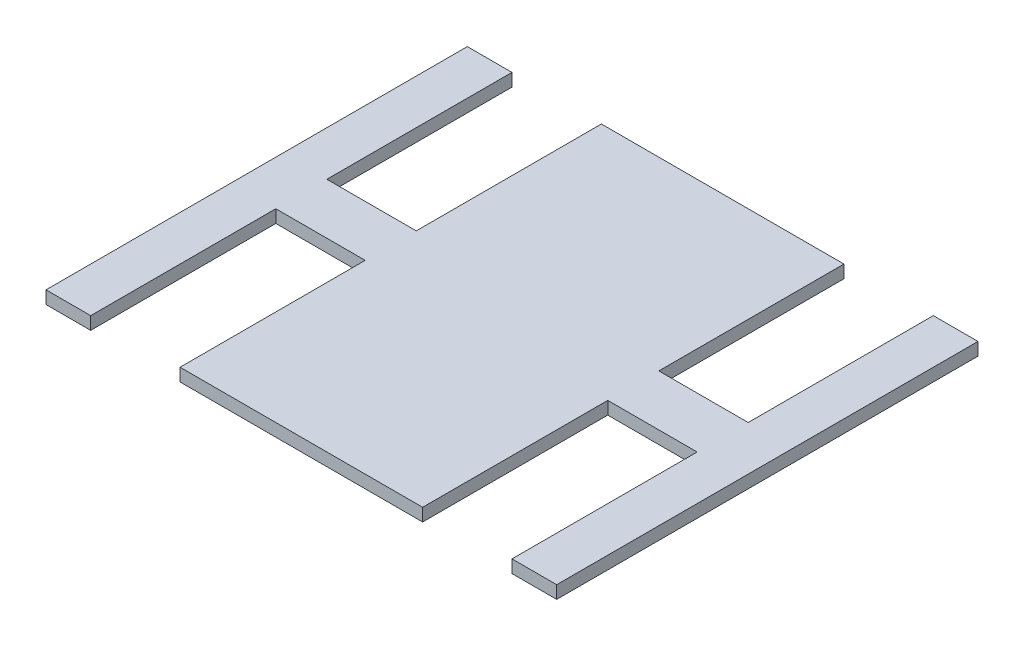
ISO-10303-21;
HEADER;
FILE_DESCRIPTION(('STEP AP214'),'2;1');
FILE_NAME('part.step','',(''),(''),'','','');
FILE_SCHEMA(('AUTOMOTIVE_DESIGN { 1 0 10303 214 1 1 1 1 }'));
ENDSEC;
DATA;
#1=APPLICATION_CONTEXT('core data for automotive mechanical design processes');
#2=APPLICATION_PROTOCOL_DEFINITION('international standard','automotive_design',2000,#1);
#3=PRODUCT_CONTEXT('',#1,'mechanical');
#4=PRODUCT('Part','Part','',(#3));
#5=PRODUCT_RELATED_PRODUCT_CATEGORY('part','',(#4));
#6=PRODUCT_DEFINITION_FORMATION('','',#4);
#7=PRODUCT_DEFINITION_CONTEXT('part definition',#1,'design');
#8=PRODUCT_DEFINITION('design','',#6,#7);
#9=PRODUCT_DEFINITION_SHAPE('','',#8);
#10=(LENGTH_UNIT() NAMED_UNIT(*) SI_UNIT(.MILLI.,.METRE.));
#11=(NAMED_UNIT(*) PLANE_ANGLE_UNIT() SI_UNIT($,.RADIAN.));
#12=(NAMED_UNIT(*) SI_UNIT($,.STERADIAN.) SOLID_ANGLE_UNIT());
#13=UNCERTAINTY_MEASURE_WITH_UNIT(LENGTH_MEASURE(1.E-05),#10,'distance_accuracy_value','');
#14=(GEOMETRIC_REPRESENTATION_CONTEXT(3) GLOBAL_UNCERTAINTY_ASSIGNED_CONTEXT((#13)) GLOBAL_UNIT_ASSIGNED_CONTEXT((#10,
#11,#12)) REPRESENTATION_CONTEXT('',''));
#15=CARTESIAN_POINT('',(0.,0.,0.));
#16=DIRECTION('',(0.,0.,1.));
#17=DIRECTION('',(1.,0.,0.));
#18=AXIS2_PLACEMENT_3D('',#15,#16,#17);
#19=CARTESIAN_POINT('',(0.,10.,165.));
#20=DIRECTION('',(0.,0.,-1.));
#21=DIRECTION('',(-1.,0.,0.));
#22=AXIS2_PLACEMENT_3D('',#19,#20,#21);
#23=PLANE('',#22);
#24=DIRECTION('',(1.,0.,0.));
#25=VECTOR('',#24,1.);
#26=CARTESIAN_POINT('',(0.,0.,165.));
#27=LINE('',#26,#25);
#28=CARTESIAN_POINT('',(-95.,0.,165.));
#29=VERTEX_POINT('',#28);
#30=CARTESIAN_POINT('',(95.,0.,165.));
#31=VERTEX_POINT('',#30);
#32=EDGE_CURVE('E206',#29,#31,#27,.T.);
#33=ORIENTED_EDGE('',*,*,#32,.T.);
#34=DIRECTION('',(0.,-1.,0.));
#35=VECTOR('',#34,1.);
#36=CARTESIAN_POINT('',(95.,10.,165.));
#37=LINE('',#36,#35);
#38=CARTESIAN_POINT('',(95.,10.,165.));
#39=VERTEX_POINT('',#38);
#40=EDGE_CURVE('E11',#39,#31,#37,.T.);
#41=ORIENTED_EDGE('',*,*,#40,.F.);
#42=DIRECTION('',(1.,0.,0.));
#43=VECTOR('',#42,1.);
#44=CARTESIAN_POINT('',(0.,10.,165.));
#45=LINE('',#44,#43);
#46=CARTESIAN_POINT('',(-95.,10.,165.));
#47=VERTEX_POINT('',#46);
#48=EDGE_CURVE('E254',#47,#39,#45,.T.);
#49=ORIENTED_EDGE('',*,*,#48,.F.);
#50=DIRECTION('',(0.,-1.,0.));
#51=VECTOR('',#50,1.);
#52=CARTESIAN_POINT('',(-95.,10.,165.));
#53=LINE('',#52,#51);
#54=EDGE_CURVE('E52',#47,#29,#53,.T.);
#55=ORIENTED_EDGE('',*,*,#54,.T.);
#56=EDGE_LOOP('',(#33,#41,#49,#55));
#57=FACE_BOUND('',#56,.T.);
#58=ADVANCED_FACE('F35',(#57),#23,.F.);
#59=CARTESIAN_POINT('',(95.,10.,0.));
#60=DIRECTION('',(-1.,0.,0.));
#61=DIRECTION('',(0.,0.,1.));
#62=AXIS2_PLACEMENT_3D('',#59,#60,#61);
#63=PLANE('',#62);
#64=DIRECTION('',(0.,0.,-1.));
#65=VECTOR('',#64,1.);
#66=CARTESIAN_POINT('',(95.,0.,0.));
#67=LINE('',#66,#65);
#68=CARTESIAN_POINT('',(95.,0.,20.));
#69=VERTEX_POINT('',#68);
#70=EDGE_CURVE('E208',#31,#69,#67,.T.);
#71=ORIENTED_EDGE('',*,*,#70,.T.);
#72=DIRECTION('',(0.,-1.,0.));
#73=VECTOR('',#72,1.);
#74=CARTESIAN_POINT('',(95.,10.,20.));
#75=LINE('',#74,#73);
#76=CARTESIAN_POINT('',(95.,10.,20.));
#77=VERTEX_POINT('',#76);
#78=EDGE_CURVE('E44',#77,#69,#75,.T.);
#79=ORIENTED_EDGE('',*,*,#78,.F.);
#80=DIRECTION('',(0.,0.,-1.));
#81=VECTOR('',#80,1.);
#82=CARTESIAN_POINT('',(95.,10.,0.));
#83=LINE('',#82,#81);
#84=EDGE_CURVE('E126',#39,#77,#83,.T.);
#85=ORIENTED_EDGE('',*,*,#84,.F.);
#86=ORIENTED_EDGE('',*,*,#40,.T.);
#87=EDGE_LOOP('',(#71,#79,#85,#86));
#88=FACE_BOUND('',#87,.T.);
#89=ADVANCED_FACE('F37',(#88),#63,.F.);
#90=CARTESIAN_POINT('',(0.,10.,20.0000000000001));
#91=DIRECTION('',(0.,0.,1.));
#92=DIRECTION('',(1.,0.,0.));
#93=AXIS2_PLACEMENT_3D('',#90,#91,#92);
#94=PLANE('',#93);
#95=DIRECTION('',(-1.,0.,0.));
#96=VECTOR('',#95,1.);
#97=CARTESIAN_POINT('',(0.,0.,20.0000000000001));
#98=LINE('',#97,#96);
#99=CARTESIAN_POINT('',(165.,0.,20.));
#100=VERTEX_POINT('',#99);
#101=EDGE_CURVE('E213',#100,#69,#98,.T.);
#102=ORIENTED_EDGE('',*,*,#101,.F.);
#103=DIRECTION('',(0.,-1.,0.));
#104=VECTOR('',#103,1.);
#105=CARTESIAN_POINT('',(165.,10.,20.));
#106=LINE('',#105,#104);
#107=CARTESIAN_POINT('',(165.,10.,20.));
#108=VERTEX_POINT('',#107);
#109=EDGE_CURVE('E285',#108,#100,#106,.T.);
#110=ORIENTED_EDGE('',*,*,#109,.F.);
#111=DIRECTION('',(-1.,0.,0.));
#112=VECTOR('',#111,1.);
#113=CARTESIAN_POINT('',(0.,10.,20.0000000000001));
#114=LINE('',#113,#112);
#115=EDGE_CURVE('E291',#108,#77,#114,.T.);
#116=ORIENTED_EDGE('',*,*,#115,.T.);
#117=ORIENTED_EDGE('',*,*,#78,.T.);
#118=EDGE_LOOP('',(#102,#110,#116,#117));
#119=FACE_BOUND('',#118,.T.);
#120=ADVANCED_FACE('F289',(#119),#94,.T.);
#121=CARTESIAN_POINT('',(165.,10.,0.));
#122=DIRECTION('',(-1.,0.,0.));
#123=DIRECTION('',(0.,0.,1.));
#124=AXIS2_PLACEMENT_3D('',#121,#122,#123);
#125=PLANE('',#124);
#126=DIRECTION('',(0.,0.,-1.));
#127=VECTOR('',#126,1.);
#128=CARTESIAN_POINT('',(165.,0.,0.));
#129=LINE('',#128,#127);
#130=CARTESIAN_POINT('',(165.,0.,165.));
#131=VERTEX_POINT('',#130);
#132=EDGE_CURVE('E216',#131,#100,#129,.T.);
#133=ORIENTED_EDGE('',*,*,#132,.F.);
#134=DIRECTION('',(0.,-1.,0.));
#135=VECTOR('',#134,1.);
#136=CARTESIAN_POINT('',(165.,10.,165.));
#137=LINE('',#136,#135);
#138=CARTESIAN_POINT('',(165.,10.,165.));
#139=VERTEX_POINT('',#138);
#140=EDGE_CURVE('E283',#139,#131,#137,.T.);
#141=ORIENTED_EDGE('',*,*,#140,.F.);
#142=DIRECTION('',(0.,0.,-1.));
#143=VECTOR('',#142,1.);
#144=CARTESIAN_POINT('',(165.,10.,0.));
#145=LINE('',#144,#143);
#146=EDGE_CURVE('E303',#139,#108,#145,.T.);
#147=ORIENTED_EDGE('',*,*,#146,.T.);
#148=ORIENTED_EDGE('',*,*,#109,.T.);
#149=EDGE_LOOP('',(#133,#141,#147,#148));
#150=FACE_BOUND('',#149,.T.);
#151=ADVANCED_FACE('F299',(#150),#125,.T.);
#152=CARTESIAN_POINT('',(200.,0.,165.));
#153=VERTEX_POINT('',#152);
#154=EDGE_CURVE('E210',#131,#153,#27,.T.);
#155=ORIENTED_EDGE('',*,*,#154,.T.);
#156=DIRECTION('',(0.,-1.,0.));
#157=VECTOR('',#156,1.);
#158=CARTESIAN_POINT('',(200.,10.,165.));
#159=LINE('',#158,#157);
#160=CARTESIAN_POINT('',(200.,10.,165.));
#161=VERTEX_POINT('',#160);
#162=EDGE_CURVE('E280',#161,#153,#159,.T.);
#163=ORIENTED_EDGE('',*,*,#162,.F.);
#164=EDGE_CURVE('E305',#139,#161,#45,.T.);
#165=ORIENTED_EDGE('',*,*,#164,.F.);
#166=ORIENTED_EDGE('',*,*,#140,.T.);
#167=EDGE_LOOP('',(#155,#163,#165,#166));
#168=FACE_BOUND('',#167,.T.);
#169=ADVANCED_FACE('F380',(#168),#23,.F.);
#170=CARTESIAN_POINT('',(200.,10.,0.));
#171=DIRECTION('',(-1.,0.,0.));
#172=DIRECTION('',(0.,0.,1.));
#173=AXIS2_PLACEMENT_3D('',#170,#171,#172);
#174=PLANE('',#173);
#175=DIRECTION('',(0.,0.,-1.));
#176=VECTOR('',#175,1.);
#177=CARTESIAN_POINT('',(200.,0.,0.));
#178=LINE('',#177,#176);
#179=CARTESIAN_POINT('',(200.,0.,-165.));
#180=VERTEX_POINT('',#179);
#181=EDGE_CURVE('E219',#153,#180,#178,.T.);
#182=ORIENTED_EDGE('',*,*,#181,.T.);
#183=DIRECTION('',(0.,-1.,0.));
#184=VECTOR('',#183,1.);
#185=CARTESIAN_POINT('',(200.,10.,-165.));
#186=LINE('',#185,#184);
#187=CARTESIAN_POINT('',(200.,10.,-165.));
#188=VERTEX_POINT('',#187);
#189=EDGE_CURVE('E278',#188,#180,#186,.T.);
#190=ORIENTED_EDGE('',*,*,#189,.F.);
#191=DIRECTION('',(0.,0.,-1.));
#192=VECTOR('',#191,1.);
#193=CARTESIAN_POINT('',(200.,10.,0.));
#194=LINE('',#193,#192);
#195=EDGE_CURVE('E310',#161,#188,#194,.T.);
#196=ORIENTED_EDGE('',*,*,#195,.F.);
#197=ORIENTED_EDGE('',*,*,#162,.T.);
#198=EDGE_LOOP('',(#182,#190,#196,#197));
#199=FACE_BOUND('',#198,.T.);
#200=ADVANCED_FACE('F388',(#199),#174,.F.);
#201=CARTESIAN_POINT('',(0.,10.,-165.));
#202=DIRECTION('',(0.,0.,-1.));
#203=DIRECTION('',(-1.,0.,0.));
#204=AXIS2_PLACEMENT_3D('',#201,#202,#203);
#205=PLANE('',#204);
#206=DIRECTION('',(1.,0.,0.));
#207=VECTOR('',#206,1.);
#208=CARTESIAN_POINT('',(0.,0.,-165.));
#209=LINE('',#208,#207);
#210=CARTESIAN_POINT('',(165.,0.,-165.));
#211=VERTEX_POINT('',#210);
#212=EDGE_CURVE('E222',#211,#180,#209,.T.);
#213=ORIENTED_EDGE('',*,*,#212,.F.);
#214=DIRECTION('',(0.,-1.,0.));
#215=VECTOR('',#214,1.);
#216=CARTESIAN_POINT('',(165.,10.,-165.));
#217=LINE('',#216,#215);
#218=CARTESIAN_POINT('',(165.,10.,-165.));
#219=VERTEX_POINT('',#218);
#220=EDGE_CURVE('E276',#219,#211,#217,.T.);
#221=ORIENTED_EDGE('',*,*,#220,.F.);
#222=DIRECTION('',(1.,0.,0.));
#223=VECTOR('',#222,1.);
#224=CARTESIAN_POINT('',(0.,10.,-165.));
#225=LINE('',#224,#223);
#226=EDGE_CURVE('E312',#219,#188,#225,.T.);
#227=ORIENTED_EDGE('',*,*,#226,.T.);
#228=ORIENTED_EDGE('',*,*,#189,.T.);
#229=EDGE_LOOP('',(#213,#221,#227,#228));
#230=FACE_BOUND('',#229,.T.);
#231=ADVANCED_FACE('F376',(#230),#205,.T.);
#232=CARTESIAN_POINT('',(165.,10.,0.));
#233=DIRECTION('',(1.,0.,0.));
#234=DIRECTION('',(0.,0.,-1.));
#235=AXIS2_PLACEMENT_3D('',#232,#233,#234);
#236=PLANE('',#235);
#237=DIRECTION('',(0.,0.,1.));
#238=VECTOR('',#237,1.);
#239=CARTESIAN_POINT('',(165.,0.,0.));
#240=LINE('',#239,#238);
#241=CARTESIAN_POINT('',(165.,0.,-20.));
#242=VERTEX_POINT('',#241);
#243=EDGE_CURVE('E225',#211,#242,#240,.T.);
#244=ORIENTED_EDGE('',*,*,#243,.T.);
#245=DIRECTION('',(0.,-1.,0.));
#246=VECTOR('',#245,1.);
#247=CARTESIAN_POINT('',(165.,10.,-20.));
#248=LINE('',#247,#246);
#249=CARTESIAN_POINT('',(165.,10.,-20.));
#250=VERTEX_POINT('',#249);
#251=EDGE_CURVE('E274',#250,#242,#248,.T.);
#252=ORIENTED_EDGE('',*,*,#251,.F.);
#253=DIRECTION('',(0.,0.,1.));
#254=VECTOR('',#253,1.);
#255=CARTESIAN_POINT('',(165.,10.,0.));
#256=LINE('',#255,#254);
#257=EDGE_CURVE('E315',#219,#250,#256,.T.);
#258=ORIENTED_EDGE('',*,*,#257,.F.);
#259=ORIENTED_EDGE('',*,*,#220,.T.);
#260=EDGE_LOOP('',(#244,#252,#258,#259));
#261=FACE_BOUND('',#260,.T.);
#262=ADVANCED_FACE('F488',(#261),#236,.F.);
#263=CARTESIAN_POINT('',(0.,10.,-20.));
#264=DIRECTION('',(0.,0.,-1.));
#265=DIRECTION('',(-1.,0.,0.));
#266=AXIS2_PLACEMENT_3D('',#263,#264,#265);
#267=PLANE('',#266);
#268=DIRECTION('',(1.,0.,0.));
#269=VECTOR('',#268,1.);
#270=CARTESIAN_POINT('',(0.,0.,-20.));
#271=LINE('',#270,#269);
#272=CARTESIAN_POINT('',(95.,0.,-20.));
#273=VERTEX_POINT('',#272);
#274=EDGE_CURVE('E230',#273,#242,#271,.T.);
#275=ORIENTED_EDGE('',*,*,#274,.F.);
#276=DIRECTION('',(0.,-1.,0.));
#277=VECTOR('',#276,1.);
#278=CARTESIAN_POINT('',(95.,10.,-20.));
#279=LINE('',#278,#277);
#280=CARTESIAN_POINT('',(95.,10.,-20.));
#281=VERTEX_POINT('',#280);
#282=EDGE_CURVE('E272',#281,#273,#279,.T.);
#283=ORIENTED_EDGE('',*,*,#282,.F.);
#284=DIRECTION('',(1.,0.,0.));
#285=VECTOR('',#284,1.);
#286=CARTESIAN_POINT('',(0.,10.,-20.));
#287=LINE('',#286,#285);
#288=EDGE_CURVE('E319',#281,#250,#287,.T.);
#289=ORIENTED_EDGE('',*,*,#288,.T.);
#290=ORIENTED_EDGE('',*,*,#251,.T.);
#291=EDGE_LOOP('',(#275,#283,#289,#290));
#292=FACE_BOUND('',#291,.T.);
#293=ADVANCED_FACE('F480',(#292),#267,.T.);
#294=CARTESIAN_POINT('',(95.,10.,0.));
#295=DIRECTION('',(1.,0.,0.));
#296=DIRECTION('',(0.,0.,-1.));
#297=AXIS2_PLACEMENT_3D('',#294,#295,#296);
#298=PLANE('',#297);
#299=DIRECTION('',(0.,0.,1.));
#300=VECTOR('',#299,1.);
#301=CARTESIAN_POINT('',(95.,0.,0.));
#302=LINE('',#301,#300);
#303=CARTESIAN_POINT('',(95.,0.,-165.));
#304=VERTEX_POINT('',#303);
#305=EDGE_CURVE('E233',#304,#273,#302,.T.);
#306=ORIENTED_EDGE('',*,*,#305,.F.);
#307=DIRECTION('',(0.,-1.,0.));
#308=VECTOR('',#307,1.);
#309=CARTESIAN_POINT('',(95.,10.,-165.));
#310=LINE('',#309,#308);
#311=CARTESIAN_POINT('',(95.,10.,-165.));
#312=VERTEX_POINT('',#311);
#313=EDGE_CURVE('E270',#312,#304,#310,.T.);
#314=ORIENTED_EDGE('',*,*,#313,.F.);
#315=DIRECTION('',(0.,0.,1.));
#316=VECTOR('',#315,1.);
#317=CARTESIAN_POINT('',(95.,10.,0.));
#318=LINE('',#317,#316);
#319=EDGE_CURVE('E322',#312,#281,#318,.T.);
#320=ORIENTED_EDGE('',*,*,#319,.T.);
#321=ORIENTED_EDGE('',*,*,#282,.T.);
#322=EDGE_LOOP('',(#306,#314,#320,#321));
#323=FACE_BOUND('',#322,.T.);
#324=ADVANCED_FACE('F350',(#323),#298,.T.);
#325=CARTESIAN_POINT('',(-95.0000000000001,0.,-165.));
#326=VERTEX_POINT('',#325);
#327=EDGE_CURVE('E227',#326,#304,#209,.T.);
#328=ORIENTED_EDGE('',*,*,#327,.F.);
#329=DIRECTION('',(0.,-1.,0.));
#330=VECTOR('',#329,1.);
#331=CARTESIAN_POINT('',(-95.0000000000001,10.,-165.));
#332=LINE('',#331,#330);
#333=CARTESIAN_POINT('',(-95.0000000000001,10.,-165.));
#334=VERTEX_POINT('',#333);
#335=EDGE_CURVE('E268',#334,#326,#332,.T.);
#336=ORIENTED_EDGE('',*,*,#335,.F.);
#337=EDGE_CURVE('E317',#334,#312,#225,.T.);
#338=ORIENTED_EDGE('',*,*,#337,.T.);
#339=ORIENTED_EDGE('',*,*,#313,.T.);
#340=EDGE_LOOP('',(#328,#336,#338,#339));
#341=FACE_BOUND('',#340,.T.);
#342=ADVANCED_FACE('F342',(#341),#205,.T.);
#343=CARTESIAN_POINT('',(-95.,10.,0.));
#344=DIRECTION('',(1.,0.,0.));
#345=DIRECTION('',(0.,0.,-1.));
#346=AXIS2_PLACEMENT_3D('',#343,#344,#345);
#347=PLANE('',#346);
#348=DIRECTION('',(0.,0.,1.));
#349=VECTOR('',#348,1.);
#350=CARTESIAN_POINT('',(-95.,0.,0.));
#351=LINE('',#350,#349);
#352=CARTESIAN_POINT('',(-95.,0.,-20.));
#353=VERTEX_POINT('',#352);
#354=EDGE_CURVE('E236',#326,#353,#351,.T.);
#355=ORIENTED_EDGE('',*,*,#354,.T.);
#356=DIRECTION('',(0.,-1.,0.));
#357=VECTOR('',#356,1.);
#358=CARTESIAN_POINT('',(-95.,10.,-20.));
#359=LINE('',#358,#357);
#360=CARTESIAN_POINT('',(-95.,10.,-20.));
#361=VERTEX_POINT('',#360);
#362=EDGE_CURVE('E266',#361,#353,#359,.T.);
#363=ORIENTED_EDGE('',*,*,#362,.F.);
#364=DIRECTION('',(0.,0.,1.));
#365=VECTOR('',#364,1.);
#366=CARTESIAN_POINT('',(-95.,10.,0.));
#367=LINE('',#366,#365);
#368=EDGE_CURVE('E325',#334,#361,#367,.T.);
#369=ORIENTED_EDGE('',*,*,#368,.F.);
#370=ORIENTED_EDGE('',*,*,#335,.T.);
#371=EDGE_LOOP('',(#355,#363,#369,#370));
#372=FACE_BOUND('',#371,.T.);
#373=ADVANCED_FACE('F367',(#372),#347,.F.);
#374=CARTESIAN_POINT('',(0.,10.,-20.));
#375=DIRECTION('',(0.,0.,-1.));
#376=DIRECTION('',(-1.,0.,0.));
#377=AXIS2_PLACEMENT_3D('',#374,#375,#376);
#378=PLANE('',#377);
#379=DIRECTION('',(1.,0.,0.));
#380=VECTOR('',#379,1.);
#381=CARTESIAN_POINT('',(0.,0.,-20.));
#382=LINE('',#381,#380);
#383=CARTESIAN_POINT('',(-165.,0.,-20.));
#384=VERTEX_POINT('',#383);
#385=EDGE_CURVE('E239',#384,#353,#382,.T.);
#386=ORIENTED_EDGE('',*,*,#385,.F.);
#387=DIRECTION('',(0.,-1.,0.));
#388=VECTOR('',#387,1.);
#389=CARTESIAN_POINT('',(-165.,10.,-20.));
#390=LINE('',#389,#388);
#391=CARTESIAN_POINT('',(-165.,10.,-20.));
#392=VERTEX_POINT('',#391);
#393=EDGE_CURVE('E264',#392,#384,#390,.T.);
#394=ORIENTED_EDGE('',*,*,#393,.F.);
#395=DIRECTION('',(1.,0.,0.));
#396=VECTOR('',#395,1.);
#397=CARTESIAN_POINT('',(0.,10.,-20.));
#398=LINE('',#397,#396);
#399=EDGE_CURVE('E327',#392,#361,#398,.T.);
#400=ORIENTED_EDGE('',*,*,#399,.T.);
#401=ORIENTED_EDGE('',*,*,#362,.T.);
#402=EDGE_LOOP('',(#386,#394,#400,#401));
#403=FACE_BOUND('',#402,.T.);
#404=ADVANCED_FACE('F365',(#403),#378,.T.);
#405=CARTESIAN_POINT('',(-165.,10.,0.));
#406=DIRECTION('',(1.,0.,0.));
#407=DIRECTION('',(0.,0.,-1.));
#408=AXIS2_PLACEMENT_3D('',#405,#406,#407);
#409=PLANE('',#408);
#410=DIRECTION('',(0.,0.,1.));
#411=VECTOR('',#410,1.);
#412=CARTESIAN_POINT('',(-165.,0.,0.));
#413=LINE('',#412,#411);
#414=CARTESIAN_POINT('',(-165.,0.,-165.));
#415=VERTEX_POINT('',#414);
#416=EDGE_CURVE('E242',#415,#384,#413,.T.);
#417=ORIENTED_EDGE('',*,*,#416,.F.);
#418=DIRECTION('',(0.,-1.,0.));
#419=VECTOR('',#418,1.);
#420=CARTESIAN_POINT('',(-165.,10.,-165.));
#421=LINE('',#420,#419);
#422=CARTESIAN_POINT('',(-165.,10.,-165.));
#423=VERTEX_POINT('',#422);
#424=EDGE_CURVE('E262',#423,#415,#421,.T.);
#425=ORIENTED_EDGE('',*,*,#424,.F.);
#426=DIRECTION('',(0.,0.,1.));
#427=VECTOR('',#426,1.);
#428=CARTESIAN_POINT('',(-165.,10.,0.));
#429=LINE('',#428,#427);
#430=EDGE_CURVE('E330',#423,#392,#429,.T.);
#431=ORIENTED_EDGE('',*,*,#430,.T.);
#432=ORIENTED_EDGE('',*,*,#393,.T.);
#433=EDGE_LOOP('',(#417,#425,#431,#432));
#434=FACE_BOUND('',#433,.T.);
#435=ADVANCED_FACE('F362',(#434),#409,.T.);
#436=CARTESIAN_POINT('',(-200.,0.,-165.));
#437=VERTEX_POINT('',#436);
#438=EDGE_CURVE('E226',#437,#415,#209,.T.);
#439=ORIENTED_EDGE('',*,*,#438,.F.);
#440=DIRECTION('',(0.,-1.,0.));
#441=VECTOR('',#440,1.);
#442=CARTESIAN_POINT('',(-200.,10.,-165.));
#443=LINE('',#442,#441);
#444=CARTESIAN_POINT('',(-200.,10.,-165.));
#445=VERTEX_POINT('',#444);
#446=EDGE_CURVE('E260',#445,#437,#443,.T.);
#447=ORIENTED_EDGE('',*,*,#446,.F.);
#448=EDGE_CURVE('E316',#445,#423,#225,.T.);
#449=ORIENTED_EDGE('',*,*,#448,.T.);
#450=ORIENTED_EDGE('',*,*,#424,.T.);
#451=EDGE_LOOP('',(#439,#447,#449,#450));
#452=FACE_BOUND('',#451,.T.);
#453=ADVANCED_FACE('F359',(#452),#205,.T.);
#454=CARTESIAN_POINT('',(-200.,10.,0.));
#455=DIRECTION('',(-1.,0.,0.));
#456=DIRECTION('',(0.,0.,1.));
#457=AXIS2_PLACEMENT_3D('',#454,#455,#456);
#458=PLANE('',#457);
#459=DIRECTION('',(0.,0.,-1.));
#460=VECTOR('',#459,1.);
#461=CARTESIAN_POINT('',(-200.,0.,0.));
#462=LINE('',#461,#460);
#463=CARTESIAN_POINT('',(-200.,0.,165.));
#464=VERTEX_POINT('',#463);
#465=EDGE_CURVE('E245',#464,#437,#462,.T.);
#466=ORIENTED_EDGE('',*,*,#465,.F.);
#467=DIRECTION('',(0.,-1.,0.));
#468=VECTOR('',#467,1.);
#469=CARTESIAN_POINT('',(-200.,10.,165.));
#470=LINE('',#469,#468);
#471=CARTESIAN_POINT('',(-200.,10.,165.));
#472=VERTEX_POINT('',#471);
#473=EDGE_CURVE('E258',#472,#464,#470,.T.);
#474=ORIENTED_EDGE('',*,*,#473,.F.);
#475=DIRECTION('',(0.,0.,-1.));
#476=VECTOR('',#475,1.);
#477=CARTESIAN_POINT('',(-200.,10.,0.));
#478=LINE('',#477,#476);
#479=EDGE_CURVE('E332',#472,#445,#478,.T.);
#480=ORIENTED_EDGE('',*,*,#479,.T.);
#481=ORIENTED_EDGE('',*,*,#446,.T.);
#482=EDGE_LOOP('',(#466,#474,#480,#481));
#483=FACE_BOUND('',#482,.T.);
#484=ADVANCED_FACE('F391',(#483),#458,.T.);
#485=CARTESIAN_POINT('',(-165.,0.,165.));
#486=VERTEX_POINT('',#485);
#487=EDGE_CURVE('E209',#464,#486,#27,.T.);
#488=ORIENTED_EDGE('',*,*,#487,.T.);
#489=DIRECTION('',(0.,-1.,0.));
#490=VECTOR('',#489,1.);
#491=CARTESIAN_POINT('',(-165.,10.,165.));
#492=LINE('',#491,#490);
#493=CARTESIAN_POINT('',(-165.,10.,165.));
#494=VERTEX_POINT('',#493);
#495=EDGE_CURVE('E198',#494,#486,#492,.T.);
#496=ORIENTED_EDGE('',*,*,#495,.F.);
#497=EDGE_CURVE('E186',#472,#494,#45,.T.);
#498=ORIENTED_EDGE('',*,*,#497,.F.);
#499=ORIENTED_EDGE('',*,*,#473,.T.);
#500=EDGE_LOOP('',(#488,#496,#498,#499));
#501=FACE_BOUND('',#500,.T.);
#502=ADVANCED_FACE('F381',(#501),#23,.F.);
#503=CARTESIAN_POINT('',(-165.,10.,0.));
#504=DIRECTION('',(-1.,0.,0.));
#505=DIRECTION('',(0.,0.,1.));
#506=AXIS2_PLACEMENT_3D('',#503,#504,#505);
#507=PLANE('',#506);
#508=DIRECTION('',(0.,0.,-1.));
#509=VECTOR('',#508,1.);
#510=CARTESIAN_POINT('',(-165.,0.,0.));
#511=LINE('',#510,#509);
#512=CARTESIAN_POINT('',(-165.,0.,20.));
#513=VERTEX_POINT('',#512);
#514=EDGE_CURVE('E195',#486,#513,#511,.T.);
#515=ORIENTED_EDGE('',*,*,#514,.T.);
#516=DIRECTION('',(0.,-1.,0.));
#517=VECTOR('',#516,1.);
#518=CARTESIAN_POINT('',(-165.,10.,20.));
#519=LINE('',#518,#517);
#520=CARTESIAN_POINT('',(-165.,10.,20.));
#521=VERTEX_POINT('',#520);
#522=EDGE_CURVE('E192',#521,#513,#519,.T.);
#523=ORIENTED_EDGE('',*,*,#522,.F.);
#524=DIRECTION('',(0.,0.,-1.));
#525=VECTOR('',#524,1.);
#526=CARTESIAN_POINT('',(-165.,10.,0.));
#527=LINE('',#526,#525);
#528=EDGE_CURVE('E178',#494,#521,#527,.T.);
#529=ORIENTED_EDGE('',*,*,#528,.F.);
#530=ORIENTED_EDGE('',*,*,#495,.T.);
#531=EDGE_LOOP('',(#515,#523,#529,#530));
#532=FACE_BOUND('',#531,.T.);
#533=ADVANCED_FACE('F193',(#532),#507,.F.);
#534=CARTESIAN_POINT('',(0.,10.,20.));
#535=DIRECTION('',(0.,0.,1.));
#536=DIRECTION('',(1.,0.,0.));
#537=AXIS2_PLACEMENT_3D('',#534,#535,#536);
#538=PLANE('',#537);
#539=DIRECTION('',(-1.,0.,0.));
#540=VECTOR('',#539,1.);
#541=CARTESIAN_POINT('',(0.,0.,20.));
#542=LINE('',#541,#540);
#543=CARTESIAN_POINT('',(-95.,0.,20.));
#544=VERTEX_POINT('',#543);
#545=EDGE_CURVE('E249',#544,#513,#542,.T.);
#546=ORIENTED_EDGE('',*,*,#545,.F.);
#547=DIRECTION('',(0.,-1.,0.));
#548=VECTOR('',#547,1.);
#549=CARTESIAN_POINT('',(-95.,10.,20.));
#550=LINE('',#549,#548);
#551=CARTESIAN_POINT('',(-95.,10.,20.));
#552=VERTEX_POINT('',#551);
#553=EDGE_CURVE('E114',#552,#544,#550,.T.);
#554=ORIENTED_EDGE('',*,*,#553,.F.);
#555=DIRECTION('',(-1.,0.,0.));
#556=VECTOR('',#555,1.);
#557=CARTESIAN_POINT('',(0.,10.,20.));
#558=LINE('',#557,#556);
#559=EDGE_CURVE('E183',#552,#521,#558,.T.);
#560=ORIENTED_EDGE('',*,*,#559,.T.);
#561=ORIENTED_EDGE('',*,*,#522,.T.);
#562=EDGE_LOOP('',(#546,#554,#560,#561));
#563=FACE_BOUND('',#562,.T.);
#564=ADVANCED_FACE('F200',(#563),#538,.T.);
#565=CARTESIAN_POINT('',(-95.,10.,0.));
#566=DIRECTION('',(-1.,0.,0.));
#567=DIRECTION('',(0.,0.,1.));
#568=AXIS2_PLACEMENT_3D('',#565,#566,#567);
#569=PLANE('',#568);
#570=DIRECTION('',(0.,0.,-1.));
#571=VECTOR('',#570,1.);
#572=CARTESIAN_POINT('',(-95.,0.,0.));
#573=LINE('',#572,#571);
#574=EDGE_CURVE('E251',#29,#544,#573,.T.);
#575=ORIENTED_EDGE('',*,*,#574,.F.);
#576=ORIENTED_EDGE('',*,*,#54,.F.);
#577=DIRECTION('',(0.,0.,-1.));
#578=VECTOR('',#577,1.);
#579=CARTESIAN_POINT('',(-95.,10.,0.));
#580=LINE('',#579,#578);
#581=EDGE_CURVE('E201',#47,#552,#580,.T.);
#582=ORIENTED_EDGE('',*,*,#581,.T.);
#583=ORIENTED_EDGE('',*,*,#553,.T.);
#584=EDGE_LOOP('',(#575,#576,#582,#583));
#585=FACE_BOUND('',#584,.T.);
#586=ADVANCED_FACE('F397',(#585),#569,.T.);
#587=CARTESIAN_POINT('',(0.,10.,0.));
#588=DIRECTION('',(0.,1.,0.));
#589=DIRECTION('',(0.,0.,1.));
#590=AXIS2_PLACEMENT_3D('',#587,#588,#589);
#591=PLANE('',#590);
#592=ORIENTED_EDGE('',*,*,#48,.T.);
#593=ORIENTED_EDGE('',*,*,#84,.T.);
#594=ORIENTED_EDGE('',*,*,#115,.F.);
#595=ORIENTED_EDGE('',*,*,#146,.F.);
#596=ORIENTED_EDGE('',*,*,#164,.T.);
#597=ORIENTED_EDGE('',*,*,#195,.T.);
#598=ORIENTED_EDGE('',*,*,#226,.F.);
#599=ORIENTED_EDGE('',*,*,#257,.T.);
#600=ORIENTED_EDGE('',*,*,#288,.F.);
#601=ORIENTED_EDGE('',*,*,#319,.F.);
#602=ORIENTED_EDGE('',*,*,#337,.F.);
#603=ORIENTED_EDGE('',*,*,#368,.T.);
#604=ORIENTED_EDGE('',*,*,#399,.F.);
#605=ORIENTED_EDGE('',*,*,#430,.F.);
#606=ORIENTED_EDGE('',*,*,#448,.F.);
#607=ORIENTED_EDGE('',*,*,#479,.F.);
#608=ORIENTED_EDGE('',*,*,#497,.T.);
#609=ORIENTED_EDGE('',*,*,#528,.T.);
#610=ORIENTED_EDGE('',*,*,#559,.F.);
#611=ORIENTED_EDGE('',*,*,#581,.F.);
#612=EDGE_LOOP('',(#592,#593,#594,#595,#596,#597,#598,#599,#600,#601,#602,#603,#604,#605,#606,
#607,#608,#609,#610,#611));
#613=FACE_BOUND('',#612,.T.);
#614=ADVANCED_FACE('F180',(#613),#591,.T.);
#615=CARTESIAN_POINT('',(0.,0.,0.));
#616=DIRECTION('',(0.,1.,0.));
#617=DIRECTION('',(0.,0.,1.));
#618=AXIS2_PLACEMENT_3D('',#615,#616,#617);
#619=PLANE('',#618);
#620=ORIENTED_EDGE('',*,*,#32,.F.);
#621=ORIENTED_EDGE('',*,*,#574,.T.);
#622=ORIENTED_EDGE('',*,*,#545,.T.);
#623=ORIENTED_EDGE('',*,*,#514,.F.);
#624=ORIENTED_EDGE('',*,*,#487,.F.);
#625=ORIENTED_EDGE('',*,*,#465,.T.);
#626=ORIENTED_EDGE('',*,*,#438,.T.);
#627=ORIENTED_EDGE('',*,*,#416,.T.);
#628=ORIENTED_EDGE('',*,*,#385,.T.);
#629=ORIENTED_EDGE('',*,*,#354,.F.);
#630=ORIENTED_EDGE('',*,*,#327,.T.);
#631=ORIENTED_EDGE('',*,*,#305,.T.);
#632=ORIENTED_EDGE('',*,*,#274,.T.);
#633=ORIENTED_EDGE('',*,*,#243,.F.);
#634=ORIENTED_EDGE('',*,*,#212,.T.);
#635=ORIENTED_EDGE('',*,*,#181,.F.);
#636=ORIENTED_EDGE('',*,*,#154,.F.);
#637=ORIENTED_EDGE('',*,*,#132,.T.);
#638=ORIENTED_EDGE('',*,*,#101,.T.);
#639=ORIENTED_EDGE('',*,*,#70,.F.);
#640=EDGE_LOOP('',(#620,#621,#622,#623,#624,#625,#626,#627,#628,#629,#630,#631,#632,#633,#634,
#635,#636,#637,#638,#639));
#641=FACE_BOUND('',#640,.T.);
#642=ADVANCED_FACE('F294',(#641),#619,.F.);
#643=CLOSED_SHELL('',(#58,#89,#120,#151,#169,#200,#231,#262,#293,#324,#342,#373,#404,#435,#453,
#484,#502,#533,#564,#586,#614,#642));
#644=MANIFOLD_SOLID_BREP('B2',#643);
#645=ADVANCED_BREP_SHAPE_REPRESENTATION('',(#18,#644),#14);
#646=SHAPE_DEFINITION_REPRESENTATION(#9,#645);
ENDSEC;
END-ISO-10303-21;
